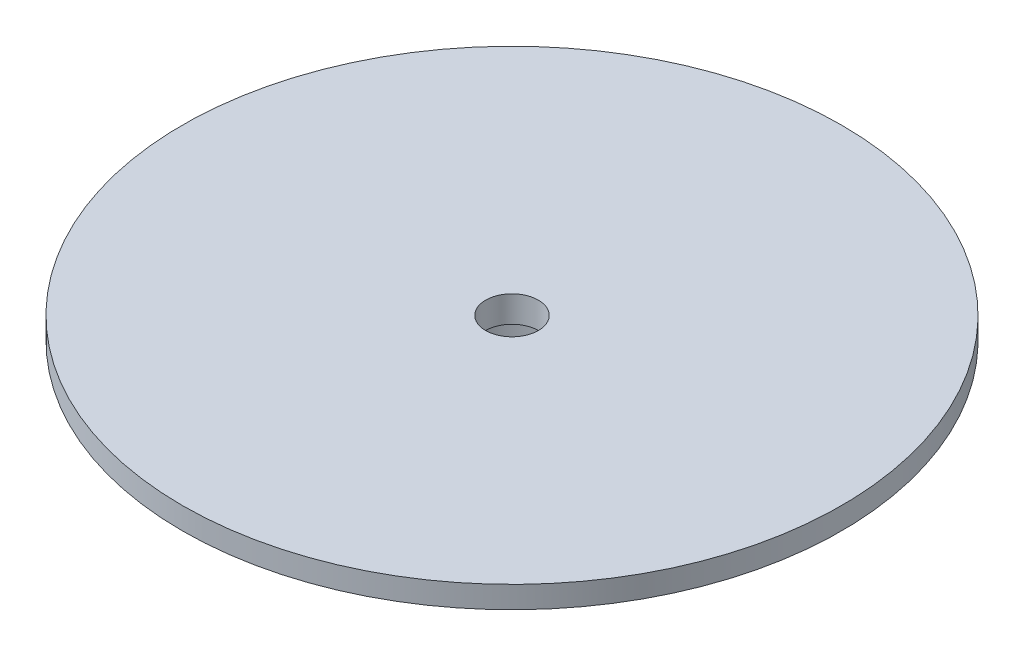
ISO-10303-21;
HEADER;
FILE_DESCRIPTION(('STEP AP214'),'2;1');
FILE_NAME('part.step','',(''),(''),'','','');
FILE_SCHEMA(('AUTOMOTIVE_DESIGN { 1 0 10303 214 1 1 1 1 }'));
ENDSEC;
DATA;
#1=APPLICATION_CONTEXT('core data for automotive mechanical design processes');
#2=APPLICATION_PROTOCOL_DEFINITION('international standard','automotive_design',2000,#1);
#3=PRODUCT_CONTEXT('',#1,'mechanical');
#4=PRODUCT('Part','Part','',(#3));
#5=PRODUCT_RELATED_PRODUCT_CATEGORY('part','',(#4));
#6=PRODUCT_DEFINITION_FORMATION('','',#4);
#7=PRODUCT_DEFINITION_CONTEXT('part definition',#1,'design');
#8=PRODUCT_DEFINITION('design','',#6,#7);
#9=PRODUCT_DEFINITION_SHAPE('','',#8);
#10=(LENGTH_UNIT() NAMED_UNIT(*) SI_UNIT(.MILLI.,.METRE.));
#11=(NAMED_UNIT(*) PLANE_ANGLE_UNIT() SI_UNIT($,.RADIAN.));
#12=(NAMED_UNIT(*) SI_UNIT($,.STERADIAN.) SOLID_ANGLE_UNIT());
#13=UNCERTAINTY_MEASURE_WITH_UNIT(LENGTH_MEASURE(1.E-05),#10,'distance_accuracy_value','');
#14=(GEOMETRIC_REPRESENTATION_CONTEXT(3) GLOBAL_UNCERTAINTY_ASSIGNED_CONTEXT((#13)) GLOBAL_UNIT_ASSIGNED_CONTEXT((#10,
#11,#12)) REPRESENTATION_CONTEXT('',''));
#15=CARTESIAN_POINT('',(0.,0.,0.));
#16=DIRECTION('',(0.,0.,1.));
#17=DIRECTION('',(1.,0.,0.));
#18=AXIS2_PLACEMENT_3D('',#15,#16,#17);
#19=CARTESIAN_POINT('',(0.,0.,0.));
#20=DIRECTION('',(0.,1.,0.));
#21=DIRECTION('',(0.,0.,1.));
#22=AXIS2_PLACEMENT_3D('',#19,#20,#21);
#23=PLANE('',#22);
#24=CARTESIAN_POINT('',(0.,0.,0.));
#25=DIRECTION('',(0.,1.,0.));
#26=DIRECTION('',(0.,0.,1.));
#27=AXIS2_PLACEMENT_3D('',#24,#25,#26);
#28=CIRCLE('',#27,41.);
#29=CARTESIAN_POINT('',(0.,0.,41.));
#30=VERTEX_POINT('',#29);
#31=EDGE_CURVE('E50',#30,#30,#28,.T.);
#32=ORIENTED_EDGE('',*,*,#31,.F.);
#33=EDGE_LOOP('',(#32));
#34=FACE_BOUND('',#33,.T.);
#35=CARTESIAN_POINT('',(0.,0.,0.));
#36=DIRECTION('',(0.,1.,0.));
#37=DIRECTION('',(0.,0.,1.));
#38=AXIS2_PLACEMENT_3D('',#35,#36,#37);
#39=CIRCLE('',#38,25.);
#40=CARTESIAN_POINT('',(0.,0.,25.));
#41=VERTEX_POINT('',#40);
#42=EDGE_CURVE('E10',#41,#41,#39,.F.);
#43=ORIENTED_EDGE('',*,*,#42,.F.);
#44=EDGE_LOOP('',(#43));
#45=FACE_BOUND('',#44,.T.);
#46=ADVANCED_FACE('F37',(#34,#45),#23,.F.);
#47=CARTESIAN_POINT('',(0.,10.,0.));
#48=DIRECTION('',(0.,-1.,0.));
#49=DIRECTION('',(0.,0.,-1.));
#50=AXIS2_PLACEMENT_3D('',#47,#48,#49);
#51=CYLINDRICAL_SURFACE('',#50,41.);
#52=ORIENTED_EDGE('',*,*,#31,.T.);
#53=EDGE_LOOP('',(#52));
#54=FACE_BOUND('',#53,.T.);
#55=CARTESIAN_POINT('',(0.,5.,0.));
#56=DIRECTION('',(0.,1.,0.));
#57=DIRECTION('',(0.,0.,1.));
#58=AXIS2_PLACEMENT_3D('',#55,#56,#57);
#59=CIRCLE('',#58,41.);
#60=CARTESIAN_POINT('',(0.,5.,41.));
#61=VERTEX_POINT('',#60);
#62=EDGE_CURVE('E45',#61,#61,#59,.T.);
#63=ORIENTED_EDGE('',*,*,#62,.F.);
#64=EDGE_LOOP('',(#63));
#65=FACE_BOUND('',#64,.T.);
#66=ADVANCED_FACE('F39',(#54,#65),#51,.T.);
#67=CARTESIAN_POINT('',(0.,10.,0.));
#68=DIRECTION('',(0.,-1.,0.));
#69=DIRECTION('',(0.,0.,-1.));
#70=AXIS2_PLACEMENT_3D('',#67,#68,#69);
#71=CYLINDRICAL_SURFACE('',#70,6.);
#72=CARTESIAN_POINT('',(0.,10.,0.));
#73=DIRECTION('',(0.,1.,0.));
#74=DIRECTION('',(0.,0.,1.));
#75=AXIS2_PLACEMENT_3D('',#72,#73,#74);
#76=CIRCLE('',#75,6.);
#77=CARTESIAN_POINT('',(0.,10.,6.));
#78=VERTEX_POINT('',#77);
#79=EDGE_CURVE('E55',#78,#78,#76,.T.);
#80=ORIENTED_EDGE('',*,*,#79,.T.);
#81=EDGE_LOOP('',(#80));
#82=FACE_BOUND('',#81,.T.);
#83=CARTESIAN_POINT('',(0.,4.,0.));
#84=DIRECTION('',(0.,-1.,0.));
#85=DIRECTION('',(0.,0.,-1.));
#86=AXIS2_PLACEMENT_3D('',#83,#84,#85);
#87=CIRCLE('',#86,6.);
#88=CARTESIAN_POINT('',(0.,4.,-6.));
#89=VERTEX_POINT('',#88);
#90=EDGE_CURVE('E58',#89,#89,#87,.T.);
#91=ORIENTED_EDGE('',*,*,#90,.T.);
#92=EDGE_LOOP('',(#91));
#93=FACE_BOUND('',#92,.T.);
#94=ADVANCED_FACE('F107',(#82,#93),#71,.F.);
#95=CARTESIAN_POINT('',(0.,10.,0.));
#96=DIRECTION('',(0.,1.,0.));
#97=DIRECTION('',(0.,0.,1.));
#98=AXIS2_PLACEMENT_3D('',#95,#96,#97);
#99=PLANE('',#98);
#100=ORIENTED_EDGE('',*,*,#79,.F.);
#101=EDGE_LOOP('',(#100));
#102=FACE_BOUND('',#101,.T.);
#103=CARTESIAN_POINT('',(0.,10.,0.));
#104=DIRECTION('',(0.,1.,0.));
#105=DIRECTION('',(0.,0.,1.));
#106=AXIS2_PLACEMENT_3D('',#103,#104,#105);
#107=CIRCLE('',#106,75.);
#108=CARTESIAN_POINT('',(0.,10.,75.));
#109=VERTEX_POINT('',#108);
#110=EDGE_CURVE('E70',#109,#109,#107,.T.);
#111=ORIENTED_EDGE('',*,*,#110,.T.);
#112=EDGE_LOOP('',(#111));
#113=FACE_BOUND('',#112,.T.);
#114=ADVANCED_FACE('F112',(#102,#113),#99,.T.);
#115=CARTESIAN_POINT('',(0.,4.,0.));
#116=DIRECTION('',(0.,-1.,0.));
#117=DIRECTION('',(0.,0.,-1.));
#118=AXIS2_PLACEMENT_3D('',#115,#116,#117);
#119=CYLINDRICAL_SURFACE('',#118,17.5);
#120=CARTESIAN_POINT('',(0.,4.,0.));
#121=DIRECTION('',(0.,-1.,0.));
#122=DIRECTION('',(0.,0.,-1.));
#123=AXIS2_PLACEMENT_3D('',#120,#121,#122);
#124=CIRCLE('',#123,17.5);
#125=CARTESIAN_POINT('',(0.,4.,-17.5));
#126=VERTEX_POINT('',#125);
#127=EDGE_CURVE('E61',#126,#126,#124,.T.);
#128=ORIENTED_EDGE('',*,*,#127,.F.);
#129=EDGE_LOOP('',(#128));
#130=FACE_BOUND('',#129,.T.);
#131=CARTESIAN_POINT('',(0.,-6.83,0.));
#132=DIRECTION('',(0.,-1.,0.));
#133=DIRECTION('',(0.,0.,-1.));
#134=AXIS2_PLACEMENT_3D('',#131,#132,#133);
#135=CIRCLE('',#134,17.5);
#136=CARTESIAN_POINT('',(0.,-6.83,-17.5));
#137=VERTEX_POINT('',#136);
#138=EDGE_CURVE('E81',#137,#137,#135,.T.);
#139=ORIENTED_EDGE('',*,*,#138,.T.);
#140=EDGE_LOOP('',(#139));
#141=FACE_BOUND('',#140,.T.);
#142=ADVANCED_FACE('F86',(#130,#141),#119,.F.);
#143=CARTESIAN_POINT('',(0.,4.,0.));
#144=DIRECTION('',(0.,-1.,0.));
#145=DIRECTION('',(0.,0.,-1.));
#146=AXIS2_PLACEMENT_3D('',#143,#144,#145);
#147=PLANE('',#146);
#148=ORIENTED_EDGE('',*,*,#90,.F.);
#149=EDGE_LOOP('',(#148));
#150=FACE_BOUND('',#149,.T.);
#151=ORIENTED_EDGE('',*,*,#127,.T.);
#152=EDGE_LOOP('',(#151));
#153=FACE_BOUND('',#152,.T.);
#154=ADVANCED_FACE('F121',(#150,#153),#147,.T.);
#155=CARTESIAN_POINT('',(0.,5.,0.));
#156=DIRECTION('',(0.,1.,0.));
#157=DIRECTION('',(0.,0.,1.));
#158=AXIS2_PLACEMENT_3D('',#155,#156,#157);
#159=CYLINDRICAL_SURFACE('',#158,75.);
#160=CARTESIAN_POINT('',(0.,5.,0.));
#161=DIRECTION('',(0.,1.,0.));
#162=DIRECTION('',(0.,0.,1.));
#163=AXIS2_PLACEMENT_3D('',#160,#161,#162);
#164=CIRCLE('',#163,75.);
#165=CARTESIAN_POINT('',(0.,5.,75.));
#166=VERTEX_POINT('',#165);
#167=EDGE_CURVE('E69',#166,#166,#164,.T.);
#168=ORIENTED_EDGE('',*,*,#167,.T.);
#169=EDGE_LOOP('',(#168));
#170=FACE_BOUND('',#169,.T.);
#171=ORIENTED_EDGE('',*,*,#110,.F.);
#172=EDGE_LOOP('',(#171));
#173=FACE_BOUND('',#172,.T.);
#174=ADVANCED_FACE('F100',(#170,#173),#159,.T.);
#175=CARTESIAN_POINT('',(0.,5.,0.));
#176=DIRECTION('',(0.,1.,0.));
#177=DIRECTION('',(0.,0.,1.));
#178=AXIS2_PLACEMENT_3D('',#175,#176,#177);
#179=PLANE('',#178);
#180=ORIENTED_EDGE('',*,*,#62,.T.);
#181=EDGE_LOOP('',(#180));
#182=FACE_BOUND('',#181,.T.);
#183=ORIENTED_EDGE('',*,*,#167,.F.);
#184=EDGE_LOOP('',(#183));
#185=FACE_BOUND('',#184,.T.);
#186=ADVANCED_FACE('F91',(#182,#185),#179,.F.);
#187=CARTESIAN_POINT('',(0.,-6.83,0.));
#188=DIRECTION('',(0.,-1.,0.));
#189=DIRECTION('',(0.,0.,-1.));
#190=AXIS2_PLACEMENT_3D('',#187,#188,#189);
#191=PLANE('',#190);
#192=CARTESIAN_POINT('',(0.,-6.83,0.));
#193=DIRECTION('',(0.,-1.,0.));
#194=DIRECTION('',(0.,0.,-1.));
#195=AXIS2_PLACEMENT_3D('',#192,#193,#194);
#196=CIRCLE('',#195,25.);
#197=CARTESIAN_POINT('',(0.,-6.83,-25.));
#198=VERTEX_POINT('',#197);
#199=EDGE_CURVE('E74',#198,#198,#196,.T.);
#200=ORIENTED_EDGE('',*,*,#199,.T.);
#201=EDGE_LOOP('',(#200));
#202=FACE_BOUND('',#201,.T.);
#203=ORIENTED_EDGE('',*,*,#138,.F.);
#204=EDGE_LOOP('',(#203));
#205=FACE_BOUND('',#204,.T.);
#206=ADVANCED_FACE('F88',(#202,#205),#191,.T.);
#207=CARTESIAN_POINT('',(0.,-6.83,0.));
#208=DIRECTION('',(0.,1.,0.));
#209=DIRECTION('',(0.,0.,1.));
#210=AXIS2_PLACEMENT_3D('',#207,#208,#209);
#211=CYLINDRICAL_SURFACE('',#210,25.);
#212=ORIENTED_EDGE('',*,*,#199,.F.);
#213=EDGE_LOOP('',(#212));
#214=FACE_BOUND('',#213,.T.);
#215=ORIENTED_EDGE('',*,*,#42,.T.);
#216=EDGE_LOOP('',(#215));
#217=FACE_BOUND('',#216,.T.);
#218=ADVANCED_FACE('F90',(#214,#217),#211,.T.);
#219=CLOSED_SHELL('',(#46,#66,#94,#114,#142,#154,#174,#186,#206,#218));
#220=MANIFOLD_SOLID_BREP('B2',#219);
#221=ADVANCED_BREP_SHAPE_REPRESENTATION('',(#18,#220),#14);
#222=SHAPE_DEFINITION_REPRESENTATION(#9,#221);
ENDSEC;
END-ISO-10303-21;
